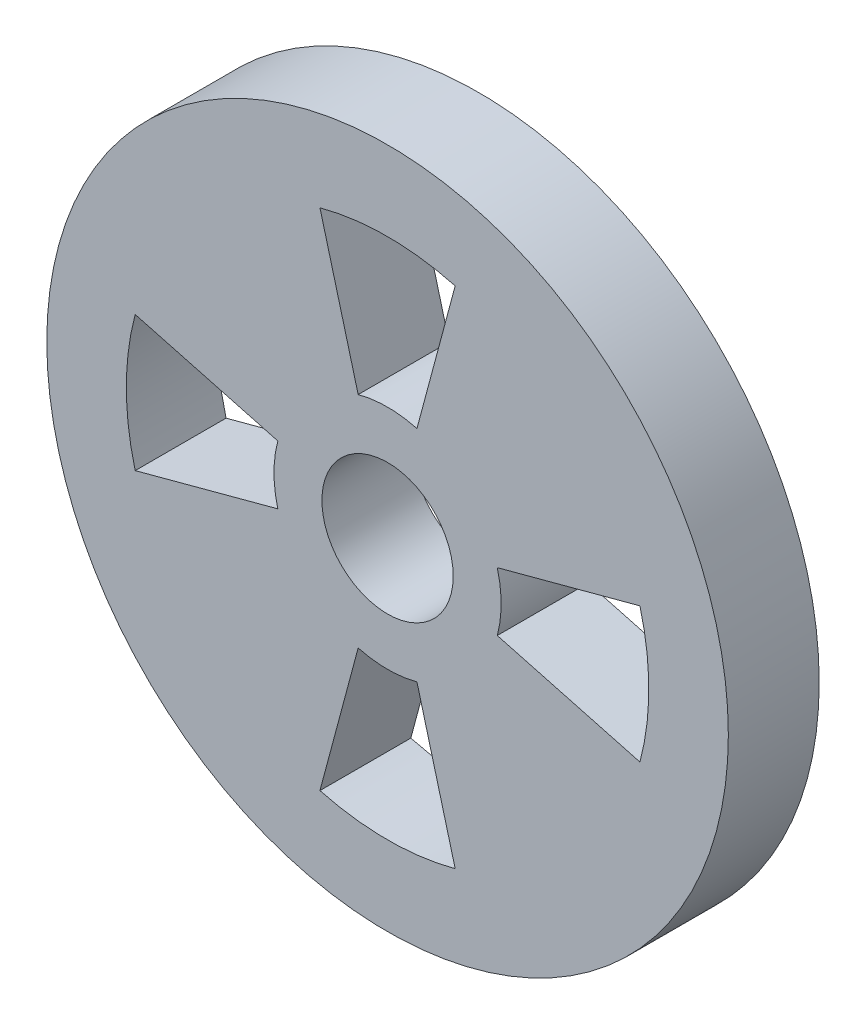
ISO-10303-21;
HEADER;
FILE_DESCRIPTION(('STEP AP214'),'2;1');
FILE_NAME('part.step','',(''),(''),'','','');
FILE_SCHEMA(('AUTOMOTIVE_DESIGN { 1 0 10303 214 1 1 1 1 }'));
ENDSEC;
DATA;
#1=APPLICATION_CONTEXT('core data for automotive mechanical design processes');
#2=APPLICATION_PROTOCOL_DEFINITION('international standard','automotive_design',2000,#1);
#3=PRODUCT_CONTEXT('',#1,'mechanical');
#4=PRODUCT('Part','Part','',(#3));
#5=PRODUCT_RELATED_PRODUCT_CATEGORY('part','',(#4));
#6=PRODUCT_DEFINITION_FORMATION('','',#4);
#7=PRODUCT_DEFINITION_CONTEXT('part definition',#1,'design');
#8=PRODUCT_DEFINITION('design','',#6,#7);
#9=PRODUCT_DEFINITION_SHAPE('','',#8);
#10=(LENGTH_UNIT() NAMED_UNIT(*) SI_UNIT(.MILLI.,.METRE.));
#11=(NAMED_UNIT(*) PLANE_ANGLE_UNIT() SI_UNIT($,.RADIAN.));
#12=(NAMED_UNIT(*) SI_UNIT($,.STERADIAN.) SOLID_ANGLE_UNIT());
#13=UNCERTAINTY_MEASURE_WITH_UNIT(LENGTH_MEASURE(1.E-05),#10,'distance_accuracy_value','');
#14=(GEOMETRIC_REPRESENTATION_CONTEXT(3) GLOBAL_UNCERTAINTY_ASSIGNED_CONTEXT((#13)) GLOBAL_UNIT_ASSIGNED_CONTEXT((#10,
#11,#12)) REPRESENTATION_CONTEXT('',''));
#15=CARTESIAN_POINT('',(0.,0.,0.));
#16=DIRECTION('',(0.,0.,1.));
#17=DIRECTION('',(1.,0.,0.));
#18=AXIS2_PLACEMENT_3D('',#15,#16,#17);
#19=CARTESIAN_POINT('',(0.,0.,4.));
#20=DIRECTION('',(0.,0.,1.));
#21=DIRECTION('',(1.,0.,0.));
#22=AXIS2_PLACEMENT_3D('',#19,#20,#21);
#23=PLANE('',#22);
#24=CARTESIAN_POINT('',(0.,0.,4.));
#25=DIRECTION('',(0.,0.,-1.));
#26=DIRECTION('',(1.,0.,0.));
#27=AXIS2_PLACEMENT_3D('',#24,#25,#26);
#28=CIRCLE('',#27,5.);
#29=CARTESIAN_POINT('',(-4.82962913144534,-1.29409522551261,4.));
#30=VERTEX_POINT('',#29);
#31=CARTESIAN_POINT('',(-4.82962913144534,1.29409522551261,4.));
#32=VERTEX_POINT('',#31);
#33=EDGE_CURVE('E55',#30,#32,#28,.T.);
#34=ORIENTED_EDGE('',*,*,#33,.F.);
#35=DIRECTION('',(0.965925826289068,0.258819045102522,0.));
#36=VECTOR('',#35,1.);
#37=CARTESIAN_POINT('',(-4.82962913144534,-1.29409522551261,4.));
#38=LINE('',#37,#36);
#39=CARTESIAN_POINT('',(-11.1081470023243,-2.976419018679,4.));
#40=VERTEX_POINT('',#39);
#41=EDGE_CURVE('E177',#40,#30,#38,.T.);
#42=ORIENTED_EDGE('',*,*,#41,.F.);
#43=CARTESIAN_POINT('',(0.,0.,4.));
#44=DIRECTION('',(0.,0.,1.));
#45=DIRECTION('',(1.,0.,0.));
#46=AXIS2_PLACEMENT_3D('',#43,#44,#45);
#47=CIRCLE('',#46,11.5);
#48=CARTESIAN_POINT('',(-11.1081470023243,2.976419018679,4.));
#49=VERTEX_POINT('',#48);
#50=EDGE_CURVE('E181',#49,#40,#47,.T.);
#51=ORIENTED_EDGE('',*,*,#50,.F.);
#52=DIRECTION('',(-0.965925826289068,0.258819045102521,0.));
#53=VECTOR('',#52,1.);
#54=CARTESIAN_POINT('',(-4.82962913144534,1.29409522551261,4.));
#55=LINE('',#54,#53);
#56=EDGE_CURVE('E190',#32,#49,#55,.T.);
#57=ORIENTED_EDGE('',*,*,#56,.F.);
#58=EDGE_LOOP('',(#34,#42,#51,#57));
#59=FACE_BOUND('',#58,.T.);
#60=CARTESIAN_POINT('',(0.,0.,4.));
#61=DIRECTION('',(0.,0.,-1.));
#62=DIRECTION('',(1.,0.,0.));
#63=AXIS2_PLACEMENT_3D('',#60,#61,#62);
#64=CIRCLE('',#63,5.);
#65=CARTESIAN_POINT('',(-1.29409522551261,4.82962913144534,4.));
#66=VERTEX_POINT('',#65);
#67=CARTESIAN_POINT('',(1.29409522551257,4.82962913144535,4.));
#68=VERTEX_POINT('',#67);
#69=EDGE_CURVE('E63',#66,#68,#64,.T.);
#70=ORIENTED_EDGE('',*,*,#69,.F.);
#71=DIRECTION('',(0.258819045102522,-0.965925826289068,0.));
#72=VECTOR('',#71,1.);
#73=CARTESIAN_POINT('',(-2.976419018679,11.1081470023243,4.));
#74=LINE('',#73,#72);
#75=CARTESIAN_POINT('',(-2.976419018679,11.1081470023243,4.));
#76=VERTEX_POINT('',#75);
#77=EDGE_CURVE('E211',#76,#66,#74,.T.);
#78=ORIENTED_EDGE('',*,*,#77,.F.);
#79=CARTESIAN_POINT('',(0.,0.,4.));
#80=DIRECTION('',(0.,0.,1.));
#81=DIRECTION('',(1.,0.,0.));
#82=AXIS2_PLACEMENT_3D('',#79,#80,#81);
#83=CIRCLE('',#82,11.5);
#84=CARTESIAN_POINT('',(2.97641901867891,11.1081470023243,4.));
#85=VERTEX_POINT('',#84);
#86=EDGE_CURVE('E231',#85,#76,#83,.T.);
#87=ORIENTED_EDGE('',*,*,#86,.F.);
#88=DIRECTION('',(0.258819045102514,0.96592582628907,0.));
#89=VECTOR('',#88,1.);
#90=CARTESIAN_POINT('',(1.29409522551257,4.82962913144535,4.));
#91=LINE('',#90,#89);
#92=EDGE_CURVE('E226',#68,#85,#91,.T.);
#93=ORIENTED_EDGE('',*,*,#92,.F.);
#94=EDGE_LOOP('',(#70,#78,#87,#93));
#95=FACE_BOUND('',#94,.T.);
#96=CARTESIAN_POINT('',(0.,0.,4.));
#97=DIRECTION('',(0.,0.,1.));
#98=DIRECTION('',(1.,0.,0.));
#99=AXIS2_PLACEMENT_3D('',#96,#97,#98);
#100=CIRCLE('',#99,11.5);
#101=CARTESIAN_POINT('',(11.1081470023243,-2.97641901867899,4.));
#102=VERTEX_POINT('',#101);
#103=CARTESIAN_POINT('',(11.1081470023243,2.976419018679,4.));
#104=VERTEX_POINT('',#103);
#105=EDGE_CURVE('E266',#102,#104,#100,.T.);
#106=ORIENTED_EDGE('',*,*,#105,.F.);
#107=DIRECTION('',(0.965925826289068,-0.258819045102521,0.));
#108=VECTOR('',#107,1.);
#109=CARTESIAN_POINT('',(11.1081470023243,-2.97641901867899,4.));
#110=LINE('',#109,#108);
#111=CARTESIAN_POINT('',(4.82962913144534,-1.29409522551261,4.));
#112=VERTEX_POINT('',#111);
#113=EDGE_CURVE('E253',#112,#102,#110,.T.);
#114=ORIENTED_EDGE('',*,*,#113,.F.);
#115=CARTESIAN_POINT('',(0.,0.,4.));
#116=DIRECTION('',(0.,0.,-1.));
#117=DIRECTION('',(1.,0.,0.));
#118=AXIS2_PLACEMENT_3D('',#115,#116,#117);
#119=CIRCLE('',#118,5.);
#120=CARTESIAN_POINT('',(4.82962913144534,1.29409522551261,4.));
#121=VERTEX_POINT('',#120);
#122=EDGE_CURVE('E274',#121,#112,#119,.T.);
#123=ORIENTED_EDGE('',*,*,#122,.F.);
#124=DIRECTION('',(-0.965925826289068,-0.258819045102522,0.));
#125=VECTOR('',#124,1.);
#126=CARTESIAN_POINT('',(11.1081470023243,2.976419018679,4.));
#127=LINE('',#126,#125);
#128=EDGE_CURVE('E269',#104,#121,#127,.T.);
#129=ORIENTED_EDGE('',*,*,#128,.F.);
#130=EDGE_LOOP('',(#106,#114,#123,#129));
#131=FACE_BOUND('',#130,.T.);
#132=CARTESIAN_POINT('',(0.,0.,4.));
#133=DIRECTION('',(0.,0.,1.));
#134=DIRECTION('',(1.,0.,0.));
#135=AXIS2_PLACEMENT_3D('',#132,#133,#134);
#136=CIRCLE('',#135,11.5);
#137=CARTESIAN_POINT('',(-2.97641901867891,-11.1081470023243,4.));
#138=VERTEX_POINT('',#137);
#139=CARTESIAN_POINT('',(2.976419018679,-11.1081470023243,4.));
#140=VERTEX_POINT('',#139);
#141=EDGE_CURVE('E310',#138,#140,#136,.T.);
#142=ORIENTED_EDGE('',*,*,#141,.F.);
#143=DIRECTION('',(-0.258819045102514,-0.96592582628907,0.));
#144=VECTOR('',#143,1.);
#145=CARTESIAN_POINT('',(-2.97641901867891,-11.1081470023243,4.));
#146=LINE('',#145,#144);
#147=CARTESIAN_POINT('',(-1.29409522551257,-4.82962913144535,4.));
#148=VERTEX_POINT('',#147);
#149=EDGE_CURVE('E297',#148,#138,#146,.T.);
#150=ORIENTED_EDGE('',*,*,#149,.F.);
#151=CARTESIAN_POINT('',(0.,0.,4.));
#152=DIRECTION('',(0.,0.,-1.));
#153=DIRECTION('',(1.,0.,0.));
#154=AXIS2_PLACEMENT_3D('',#151,#152,#153);
#155=CIRCLE('',#154,5.);
#156=CARTESIAN_POINT('',(1.29409522551261,-4.82962913144534,4.));
#157=VERTEX_POINT('',#156);
#158=EDGE_CURVE('E317',#157,#148,#155,.T.);
#159=ORIENTED_EDGE('',*,*,#158,.F.);
#160=DIRECTION('',(-0.258819045102522,0.965925826289068,0.));
#161=VECTOR('',#160,1.);
#162=CARTESIAN_POINT('',(1.29409522551261,-4.82962913144534,4.));
#163=LINE('',#162,#161);
#164=EDGE_CURVE('E313',#140,#157,#163,.T.);
#165=ORIENTED_EDGE('',*,*,#164,.F.);
#166=EDGE_LOOP('',(#142,#150,#159,#165));
#167=FACE_BOUND('',#166,.T.);
#168=CARTESIAN_POINT('',(0.,0.,4.));
#169=DIRECTION('',(0.,0.,1.));
#170=DIRECTION('',(1.,0.,0.));
#171=AXIS2_PLACEMENT_3D('',#168,#169,#170);
#172=CIRCLE('',#171,15.);
#173=CARTESIAN_POINT('',(15.,0.,4.));
#174=VERTEX_POINT('',#173);
#175=EDGE_CURVE('E11',#174,#174,#172,.T.);
#176=ORIENTED_EDGE('',*,*,#175,.T.);
#177=EDGE_LOOP('',(#176));
#178=FACE_BOUND('',#177,.T.);
#179=CARTESIAN_POINT('',(0.,0.,4.));
#180=DIRECTION('',(0.,0.,1.));
#181=DIRECTION('',(1.,0.,0.));
#182=AXIS2_PLACEMENT_3D('',#179,#180,#181);
#183=CIRCLE('',#182,2.89);
#184=CARTESIAN_POINT('',(2.89,0.,4.));
#185=VERTEX_POINT('',#184);
#186=EDGE_CURVE('E335',#185,#185,#183,.T.);
#187=ORIENTED_EDGE('',*,*,#186,.F.);
#188=EDGE_LOOP('',(#187));
#189=FACE_BOUND('',#188,.T.);
#190=ADVANCED_FACE('F39',(#59,#95,#131,#167,#178,#189),#23,.T.);
#191=CARTESIAN_POINT('',(0.,0.,0.));
#192=DIRECTION('',(0.,0.,1.));
#193=DIRECTION('',(1.,0.,0.));
#194=AXIS2_PLACEMENT_3D('',#191,#192,#193);
#195=PLANE('',#194);
#196=DIRECTION('',(0.965925826289068,0.258819045102522,0.));
#197=VECTOR('',#196,1.);
#198=CARTESIAN_POINT('',(-4.82962913144534,-1.29409522551261,0.));
#199=LINE('',#198,#197);
#200=CARTESIAN_POINT('',(-11.1081470023243,-2.976419018679,0.));
#201=VERTEX_POINT('',#200);
#202=CARTESIAN_POINT('',(-4.82962913144534,-1.29409522551261,0.));
#203=VERTEX_POINT('',#202);
#204=EDGE_CURVE('E162',#201,#203,#199,.T.);
#205=ORIENTED_EDGE('',*,*,#204,.T.);
#206=CARTESIAN_POINT('',(0.,0.,0.));
#207=DIRECTION('',(0.,0.,-1.));
#208=DIRECTION('',(1.,0.,0.));
#209=AXIS2_PLACEMENT_3D('',#206,#207,#208);
#210=CIRCLE('',#209,5.);
#211=CARTESIAN_POINT('',(-4.82962913144534,1.29409522551261,0.));
#212=VERTEX_POINT('',#211);
#213=EDGE_CURVE('E155',#203,#212,#210,.T.);
#214=ORIENTED_EDGE('',*,*,#213,.T.);
#215=DIRECTION('',(-0.965925826289068,0.258819045102521,0.));
#216=VECTOR('',#215,1.);
#217=CARTESIAN_POINT('',(-4.82962913144534,1.29409522551261,0.));
#218=LINE('',#217,#216);
#219=CARTESIAN_POINT('',(-11.1081470023243,2.97641901867899,0.));
#220=VERTEX_POINT('',#219);
#221=EDGE_CURVE('E166',#212,#220,#218,.T.);
#222=ORIENTED_EDGE('',*,*,#221,.T.);
#223=CARTESIAN_POINT('',(0.,0.,0.));
#224=DIRECTION('',(0.,0.,1.));
#225=DIRECTION('',(1.,0.,0.));
#226=AXIS2_PLACEMENT_3D('',#223,#224,#225);
#227=CIRCLE('',#226,11.5);
#228=EDGE_CURVE('E171',#220,#201,#227,.T.);
#229=ORIENTED_EDGE('',*,*,#228,.T.);
#230=EDGE_LOOP('',(#205,#214,#222,#229));
#231=FACE_BOUND('',#230,.T.);
#232=DIRECTION('',(0.258819045102522,-0.965925826289068,0.));
#233=VECTOR('',#232,1.);
#234=CARTESIAN_POINT('',(-2.976419018679,11.1081470023243,0.));
#235=LINE('',#234,#233);
#236=CARTESIAN_POINT('',(-2.976419018679,11.1081470023243,0.));
#237=VERTEX_POINT('',#236);
#238=CARTESIAN_POINT('',(-1.29409522551261,4.82962913144534,0.));
#239=VERTEX_POINT('',#238);
#240=EDGE_CURVE('E219',#237,#239,#235,.T.);
#241=ORIENTED_EDGE('',*,*,#240,.T.);
#242=CARTESIAN_POINT('',(0.,0.,0.));
#243=DIRECTION('',(0.,0.,-1.));
#244=DIRECTION('',(1.,0.,0.));
#245=AXIS2_PLACEMENT_3D('',#242,#243,#244);
#246=CIRCLE('',#245,5.);
#247=CARTESIAN_POINT('',(1.29409522551257,4.82962913144535,0.));
#248=VERTEX_POINT('',#247);
#249=EDGE_CURVE('E206',#239,#248,#246,.T.);
#250=ORIENTED_EDGE('',*,*,#249,.T.);
#251=DIRECTION('',(0.258819045102514,0.96592582628907,0.));
#252=VECTOR('',#251,1.);
#253=CARTESIAN_POINT('',(1.29409522551257,4.82962913144535,0.));
#254=LINE('',#253,#252);
#255=CARTESIAN_POINT('',(2.97641901867891,11.1081470023243,0.));
#256=VERTEX_POINT('',#255);
#257=EDGE_CURVE('E210',#248,#256,#254,.T.);
#258=ORIENTED_EDGE('',*,*,#257,.T.);
#259=CARTESIAN_POINT('',(0.,0.,0.));
#260=DIRECTION('',(0.,0.,1.));
#261=DIRECTION('',(1.,0.,0.));
#262=AXIS2_PLACEMENT_3D('',#259,#260,#261);
#263=CIRCLE('',#262,11.5);
#264=EDGE_CURVE('E215',#256,#237,#263,.T.);
#265=ORIENTED_EDGE('',*,*,#264,.T.);
#266=EDGE_LOOP('',(#241,#250,#258,#265));
#267=FACE_BOUND('',#266,.T.);
#268=DIRECTION('',(0.965925826289068,-0.258819045102521,0.));
#269=VECTOR('',#268,1.);
#270=CARTESIAN_POINT('',(11.1081470023243,-2.97641901867899,0.));
#271=LINE('',#270,#269);
#272=CARTESIAN_POINT('',(4.82962913144534,-1.29409522551261,0.));
#273=VERTEX_POINT('',#272);
#274=CARTESIAN_POINT('',(11.1081470023243,-2.97641901867899,0.));
#275=VERTEX_POINT('',#274);
#276=EDGE_CURVE('E261',#273,#275,#271,.T.);
#277=ORIENTED_EDGE('',*,*,#276,.T.);
#278=CARTESIAN_POINT('',(0.,0.,0.));
#279=DIRECTION('',(0.,0.,1.));
#280=DIRECTION('',(1.,0.,0.));
#281=AXIS2_PLACEMENT_3D('',#278,#279,#280);
#282=CIRCLE('',#281,11.5);
#283=CARTESIAN_POINT('',(11.1081470023243,2.976419018679,0.));
#284=VERTEX_POINT('',#283);
#285=EDGE_CURVE('E248',#275,#284,#282,.T.);
#286=ORIENTED_EDGE('',*,*,#285,.T.);
#287=DIRECTION('',(-0.965925826289068,-0.258819045102522,0.));
#288=VECTOR('',#287,1.);
#289=CARTESIAN_POINT('',(11.1081470023243,2.976419018679,0.));
#290=LINE('',#289,#288);
#291=CARTESIAN_POINT('',(4.82962913144534,1.29409522551261,0.));
#292=VERTEX_POINT('',#291);
#293=EDGE_CURVE('E252',#284,#292,#290,.T.);
#294=ORIENTED_EDGE('',*,*,#293,.T.);
#295=CARTESIAN_POINT('',(0.,0.,0.));
#296=DIRECTION('',(0.,0.,-1.));
#297=DIRECTION('',(1.,0.,0.));
#298=AXIS2_PLACEMENT_3D('',#295,#296,#297);
#299=CIRCLE('',#298,5.);
#300=EDGE_CURVE('E257',#292,#273,#299,.T.);
#301=ORIENTED_EDGE('',*,*,#300,.T.);
#302=EDGE_LOOP('',(#277,#286,#294,#301));
#303=FACE_BOUND('',#302,.T.);
#304=DIRECTION('',(-0.258819045102514,-0.96592582628907,0.));
#305=VECTOR('',#304,1.);
#306=CARTESIAN_POINT('',(-2.97641901867891,-11.1081470023243,0.));
#307=LINE('',#306,#305);
#308=CARTESIAN_POINT('',(-1.29409522551257,-4.82962913144535,0.));
#309=VERTEX_POINT('',#308);
#310=CARTESIAN_POINT('',(-2.97641901867891,-11.1081470023243,0.));
#311=VERTEX_POINT('',#310);
#312=EDGE_CURVE('E305',#309,#311,#307,.T.);
#313=ORIENTED_EDGE('',*,*,#312,.T.);
#314=CARTESIAN_POINT('',(0.,0.,0.));
#315=DIRECTION('',(0.,0.,1.));
#316=DIRECTION('',(1.,0.,0.));
#317=AXIS2_PLACEMENT_3D('',#314,#315,#316);
#318=CIRCLE('',#317,11.5);
#319=CARTESIAN_POINT('',(2.976419018679,-11.1081470023243,0.));
#320=VERTEX_POINT('',#319);
#321=EDGE_CURVE('E292',#311,#320,#318,.T.);
#322=ORIENTED_EDGE('',*,*,#321,.T.);
#323=DIRECTION('',(-0.258819045102522,0.965925826289068,0.));
#324=VECTOR('',#323,1.);
#325=CARTESIAN_POINT('',(1.29409522551261,-4.82962913144534,0.));
#326=LINE('',#325,#324);
#327=CARTESIAN_POINT('',(1.29409522551261,-4.82962913144534,0.));
#328=VERTEX_POINT('',#327);
#329=EDGE_CURVE('E296',#320,#328,#326,.T.);
#330=ORIENTED_EDGE('',*,*,#329,.T.);
#331=CARTESIAN_POINT('',(0.,0.,0.));
#332=DIRECTION('',(0.,0.,-1.));
#333=DIRECTION('',(1.,0.,0.));
#334=AXIS2_PLACEMENT_3D('',#331,#332,#333);
#335=CIRCLE('',#334,5.);
#336=EDGE_CURVE('E301',#328,#309,#335,.T.);
#337=ORIENTED_EDGE('',*,*,#336,.T.);
#338=EDGE_LOOP('',(#313,#322,#330,#337));
#339=FACE_BOUND('',#338,.T.);
#340=CARTESIAN_POINT('',(0.,0.,0.));
#341=DIRECTION('',(0.,0.,1.));
#342=DIRECTION('',(1.,0.,0.));
#343=AXIS2_PLACEMENT_3D('',#340,#341,#342);
#344=CIRCLE('',#343,15.);
#345=CARTESIAN_POINT('',(15.,0.,0.));
#346=VERTEX_POINT('',#345);
#347=EDGE_CURVE('E43',#346,#346,#344,.T.);
#348=ORIENTED_EDGE('',*,*,#347,.F.);
#349=EDGE_LOOP('',(#348));
#350=FACE_BOUND('',#349,.T.);
#351=CARTESIAN_POINT('',(0.,0.,0.));
#352=DIRECTION('',(0.,0.,1.));
#353=DIRECTION('',(1.,0.,0.));
#354=AXIS2_PLACEMENT_3D('',#351,#352,#353);
#355=CIRCLE('',#354,2.89);
#356=CARTESIAN_POINT('',(2.89,0.,0.));
#357=VERTEX_POINT('',#356);
#358=EDGE_CURVE('E200',#357,#357,#355,.T.);
#359=ORIENTED_EDGE('',*,*,#358,.T.);
#360=EDGE_LOOP('',(#359));
#361=FACE_BOUND('',#360,.T.);
#362=ADVANCED_FACE('F173',(#231,#267,#303,#339,#350,#361),#195,.F.);
#363=CARTESIAN_POINT('',(0.,0.,4.));
#364=DIRECTION('',(0.,0.,-1.));
#365=DIRECTION('',(-1.,0.,0.));
#366=AXIS2_PLACEMENT_3D('',#363,#364,#365);
#367=CYLINDRICAL_SURFACE('',#366,15.);
#368=ORIENTED_EDGE('',*,*,#175,.F.);
#369=EDGE_LOOP('',(#368));
#370=FACE_BOUND('',#369,.T.);
#371=ORIENTED_EDGE('',*,*,#347,.T.);
#372=EDGE_LOOP('',(#371));
#373=FACE_BOUND('',#372,.T.);
#374=ADVANCED_FACE('F41',(#370,#373),#367,.T.);
#375=CARTESIAN_POINT('',(0.,0.,4.));
#376=DIRECTION('',(0.,0.,-1.));
#377=DIRECTION('',(-1.,0.,0.));
#378=AXIS2_PLACEMENT_3D('',#375,#376,#377);
#379=CYLINDRICAL_SURFACE('',#378,2.89);
#380=ORIENTED_EDGE('',*,*,#186,.T.);
#381=EDGE_LOOP('',(#380));
#382=FACE_BOUND('',#381,.T.);
#383=ORIENTED_EDGE('',*,*,#358,.F.);
#384=EDGE_LOOP('',(#383));
#385=FACE_BOUND('',#384,.T.);
#386=ADVANCED_FACE('F344',(#382,#385),#379,.F.);
#387=CARTESIAN_POINT('',(0.,0.,0.));
#388=DIRECTION('',(0.,0.,1.));
#389=DIRECTION('',(1.,0.,0.));
#390=AXIS2_PLACEMENT_3D('',#387,#388,#389);
#391=CYLINDRICAL_SURFACE('',#390,11.5);
#392=ORIENTED_EDGE('',*,*,#141,.T.);
#393=DIRECTION('',(0.,0.,1.));
#394=VECTOR('',#393,1.);
#395=CARTESIAN_POINT('',(2.976419018679,-11.1081470023243,0.));
#396=LINE('',#395,#394);
#397=EDGE_CURVE('E309',#320,#140,#396,.T.);
#398=ORIENTED_EDGE('',*,*,#397,.F.);
#399=ORIENTED_EDGE('',*,*,#321,.F.);
#400=DIRECTION('',(0.,0.,1.));
#401=VECTOR('',#400,1.);
#402=CARTESIAN_POINT('',(-2.97641901867891,-11.1081470023243,0.));
#403=LINE('',#402,#401);
#404=EDGE_CURVE('E270',#311,#138,#403,.T.);
#405=ORIENTED_EDGE('',*,*,#404,.T.);
#406=EDGE_LOOP('',(#392,#398,#399,#405));
#407=FACE_BOUND('',#406,.T.);
#408=ADVANCED_FACE('F346',(#407),#391,.F.);
#409=CARTESIAN_POINT('',(-2.97641901867891,-11.1081470023243,0.));
#410=DIRECTION('',(-0.96592582628907,0.258819045102514,0.));
#411=DIRECTION('',(-0.258819045102514,-0.96592582628907,0.));
#412=AXIS2_PLACEMENT_3D('',#409,#410,#411);
#413=PLANE('',#412);
#414=ORIENTED_EDGE('',*,*,#149,.T.);
#415=ORIENTED_EDGE('',*,*,#404,.F.);
#416=ORIENTED_EDGE('',*,*,#312,.F.);
#417=DIRECTION('',(0.,0.,1.));
#418=VECTOR('',#417,1.);
#419=CARTESIAN_POINT('',(-1.29409522551257,-4.82962913144535,0.));
#420=LINE('',#419,#418);
#421=EDGE_CURVE('E326',#309,#148,#420,.T.);
#422=ORIENTED_EDGE('',*,*,#421,.T.);
#423=EDGE_LOOP('',(#414,#415,#416,#422));
#424=FACE_BOUND('',#423,.T.);
#425=ADVANCED_FACE('F353',(#424),#413,.F.);
#426=CARTESIAN_POINT('',(0.,0.,0.));
#427=DIRECTION('',(0.,0.,1.));
#428=DIRECTION('',(1.,0.,0.));
#429=AXIS2_PLACEMENT_3D('',#426,#427,#428);
#430=CYLINDRICAL_SURFACE('',#429,5.);
#431=ORIENTED_EDGE('',*,*,#158,.T.);
#432=ORIENTED_EDGE('',*,*,#421,.F.);
#433=ORIENTED_EDGE('',*,*,#336,.F.);
#434=DIRECTION('',(0.,0.,1.));
#435=VECTOR('',#434,1.);
#436=CARTESIAN_POINT('',(1.29409522551261,-4.82962913144534,0.));
#437=LINE('',#436,#435);
#438=EDGE_CURVE('E329',#328,#157,#437,.T.);
#439=ORIENTED_EDGE('',*,*,#438,.T.);
#440=EDGE_LOOP('',(#431,#432,#433,#439));
#441=FACE_BOUND('',#440,.T.);
#442=ADVANCED_FACE('F394',(#441),#430,.T.);
#443=CARTESIAN_POINT('',(1.29409522551261,-4.82962913144534,0.));
#444=DIRECTION('',(0.965925826289068,0.258819045102522,0.));
#445=DIRECTION('',(-0.258819045102522,0.965925826289068,0.));
#446=AXIS2_PLACEMENT_3D('',#443,#444,#445);
#447=PLANE('',#446);
#448=ORIENTED_EDGE('',*,*,#164,.T.);
#449=ORIENTED_EDGE('',*,*,#438,.F.);
#450=ORIENTED_EDGE('',*,*,#329,.F.);
#451=ORIENTED_EDGE('',*,*,#397,.T.);
#452=EDGE_LOOP('',(#448,#449,#450,#451));
#453=FACE_BOUND('',#452,.T.);
#454=ADVANCED_FACE('F388',(#453),#447,.F.);
#455=CARTESIAN_POINT('',(0.,0.,0.));
#456=DIRECTION('',(0.,0.,1.));
#457=DIRECTION('',(1.,0.,0.));
#458=AXIS2_PLACEMENT_3D('',#455,#456,#457);
#459=CYLINDRICAL_SURFACE('',#458,11.5);
#460=ORIENTED_EDGE('',*,*,#105,.T.);
#461=DIRECTION('',(0.,0.,1.));
#462=VECTOR('',#461,1.);
#463=CARTESIAN_POINT('',(11.1081470023243,2.976419018679,0.));
#464=LINE('',#463,#462);
#465=EDGE_CURVE('E265',#284,#104,#464,.T.);
#466=ORIENTED_EDGE('',*,*,#465,.F.);
#467=ORIENTED_EDGE('',*,*,#285,.F.);
#468=DIRECTION('',(0.,0.,1.));
#469=VECTOR('',#468,1.);
#470=CARTESIAN_POINT('',(11.1081470023243,-2.97641901867899,0.));
#471=LINE('',#470,#469);
#472=EDGE_CURVE('E227',#275,#102,#471,.T.);
#473=ORIENTED_EDGE('',*,*,#472,.T.);
#474=EDGE_LOOP('',(#460,#466,#467,#473));
#475=FACE_BOUND('',#474,.T.);
#476=ADVANCED_FACE('F401',(#475),#459,.F.);
#477=CARTESIAN_POINT('',(11.1081470023243,-2.97641901867899,0.));
#478=DIRECTION('',(-0.258819045102521,-0.965925826289068,0.));
#479=DIRECTION('',(0.965925826289068,-0.258819045102521,0.));
#480=AXIS2_PLACEMENT_3D('',#477,#478,#479);
#481=PLANE('',#480);
#482=ORIENTED_EDGE('',*,*,#113,.T.);
#483=ORIENTED_EDGE('',*,*,#472,.F.);
#484=ORIENTED_EDGE('',*,*,#276,.F.);
#485=DIRECTION('',(0.,0.,1.));
#486=VECTOR('',#485,1.);
#487=CARTESIAN_POINT('',(4.82962913144534,-1.29409522551261,0.));
#488=LINE('',#487,#486);
#489=EDGE_CURVE('E283',#273,#112,#488,.T.);
#490=ORIENTED_EDGE('',*,*,#489,.T.);
#491=EDGE_LOOP('',(#482,#483,#484,#490));
#492=FACE_BOUND('',#491,.T.);
#493=ADVANCED_FACE('F407',(#492),#481,.F.);
#494=CARTESIAN_POINT('',(0.,0.,0.));
#495=DIRECTION('',(0.,0.,1.));
#496=DIRECTION('',(1.,0.,0.));
#497=AXIS2_PLACEMENT_3D('',#494,#495,#496);
#498=CYLINDRICAL_SURFACE('',#497,5.);
#499=ORIENTED_EDGE('',*,*,#122,.T.);
#500=ORIENTED_EDGE('',*,*,#489,.F.);
#501=ORIENTED_EDGE('',*,*,#300,.F.);
#502=DIRECTION('',(0.,0.,1.));
#503=VECTOR('',#502,1.);
#504=CARTESIAN_POINT('',(4.82962913144534,1.29409522551261,0.));
#505=LINE('',#504,#503);
#506=EDGE_CURVE('E286',#292,#121,#505,.T.);
#507=ORIENTED_EDGE('',*,*,#506,.T.);
#508=EDGE_LOOP('',(#499,#500,#501,#507));
#509=FACE_BOUND('',#508,.T.);
#510=ADVANCED_FACE('F413',(#509),#498,.T.);
#511=CARTESIAN_POINT('',(11.1081470023243,2.976419018679,0.));
#512=DIRECTION('',(-0.258819045102522,0.965925826289068,0.));
#513=DIRECTION('',(-0.965925826289068,-0.258819045102522,0.));
#514=AXIS2_PLACEMENT_3D('',#511,#512,#513);
#515=PLANE('',#514);
#516=ORIENTED_EDGE('',*,*,#128,.T.);
#517=ORIENTED_EDGE('',*,*,#506,.F.);
#518=ORIENTED_EDGE('',*,*,#293,.F.);
#519=ORIENTED_EDGE('',*,*,#465,.T.);
#520=EDGE_LOOP('',(#516,#517,#518,#519));
#521=FACE_BOUND('',#520,.T.);
#522=ADVANCED_FACE('F409',(#521),#515,.F.);
#523=CARTESIAN_POINT('',(0.,0.,0.));
#524=DIRECTION('',(0.,0.,1.));
#525=DIRECTION('',(1.,0.,0.));
#526=AXIS2_PLACEMENT_3D('',#523,#524,#525);
#527=CYLINDRICAL_SURFACE('',#526,5.);
#528=ORIENTED_EDGE('',*,*,#69,.T.);
#529=DIRECTION('',(0.,0.,1.));
#530=VECTOR('',#529,1.);
#531=CARTESIAN_POINT('',(1.29409522551257,4.82962913144535,0.));
#532=LINE('',#531,#530);
#533=EDGE_CURVE('E223',#248,#68,#532,.T.);
#534=ORIENTED_EDGE('',*,*,#533,.F.);
#535=ORIENTED_EDGE('',*,*,#249,.F.);
#536=DIRECTION('',(0.,0.,1.));
#537=VECTOR('',#536,1.);
#538=CARTESIAN_POINT('',(-1.29409522551261,4.82962913144534,0.));
#539=LINE('',#538,#537);
#540=EDGE_CURVE('E191',#239,#66,#539,.T.);
#541=ORIENTED_EDGE('',*,*,#540,.T.);
#542=EDGE_LOOP('',(#528,#534,#535,#541));
#543=FACE_BOUND('',#542,.T.);
#544=ADVANCED_FACE('F412',(#543),#527,.T.);
#545=CARTESIAN_POINT('',(-2.976419018679,11.1081470023243,0.));
#546=DIRECTION('',(-0.965925826289068,-0.258819045102522,0.));
#547=DIRECTION('',(0.258819045102522,-0.965925826289068,0.));
#548=AXIS2_PLACEMENT_3D('',#545,#546,#547);
#549=PLANE('',#548);
#550=ORIENTED_EDGE('',*,*,#77,.T.);
#551=ORIENTED_EDGE('',*,*,#540,.F.);
#552=ORIENTED_EDGE('',*,*,#240,.F.);
#553=DIRECTION('',(0.,0.,1.));
#554=VECTOR('',#553,1.);
#555=CARTESIAN_POINT('',(-2.976419018679,11.1081470023243,0.));
#556=LINE('',#555,#554);
#557=EDGE_CURVE('E240',#237,#76,#556,.T.);
#558=ORIENTED_EDGE('',*,*,#557,.T.);
#559=EDGE_LOOP('',(#550,#551,#552,#558));
#560=FACE_BOUND('',#559,.T.);
#561=ADVANCED_FACE('F423',(#560),#549,.F.);
#562=CARTESIAN_POINT('',(0.,0.,0.));
#563=DIRECTION('',(0.,0.,1.));
#564=DIRECTION('',(1.,0.,0.));
#565=AXIS2_PLACEMENT_3D('',#562,#563,#564);
#566=CYLINDRICAL_SURFACE('',#565,11.5);
#567=ORIENTED_EDGE('',*,*,#86,.T.);
#568=ORIENTED_EDGE('',*,*,#557,.F.);
#569=ORIENTED_EDGE('',*,*,#264,.F.);
#570=DIRECTION('',(0.,0.,1.));
#571=VECTOR('',#570,1.);
#572=CARTESIAN_POINT('',(2.97641901867891,11.1081470023243,0.));
#573=LINE('',#572,#571);
#574=EDGE_CURVE('E243',#256,#85,#573,.T.);
#575=ORIENTED_EDGE('',*,*,#574,.T.);
#576=EDGE_LOOP('',(#567,#568,#569,#575));
#577=FACE_BOUND('',#576,.T.);
#578=ADVANCED_FACE('F427',(#577),#566,.F.);
#579=CARTESIAN_POINT('',(1.29409522551257,4.82962913144535,0.));
#580=DIRECTION('',(0.96592582628907,-0.258819045102514,0.));
#581=DIRECTION('',(0.258819045102514,0.96592582628907,0.));
#582=AXIS2_PLACEMENT_3D('',#579,#580,#581);
#583=PLANE('',#582);
#584=ORIENTED_EDGE('',*,*,#92,.T.);
#585=ORIENTED_EDGE('',*,*,#574,.F.);
#586=ORIENTED_EDGE('',*,*,#257,.F.);
#587=ORIENTED_EDGE('',*,*,#533,.T.);
#588=EDGE_LOOP('',(#584,#585,#586,#587));
#589=FACE_BOUND('',#588,.T.);
#590=ADVANCED_FACE('F424',(#589),#583,.F.);
#591=CARTESIAN_POINT('',(0.,0.,0.));
#592=DIRECTION('',(0.,0.,1.));
#593=DIRECTION('',(1.,0.,0.));
#594=AXIS2_PLACEMENT_3D('',#591,#592,#593);
#595=CYLINDRICAL_SURFACE('',#594,5.);
#596=ORIENTED_EDGE('',*,*,#33,.T.);
#597=DIRECTION('',(0.,0.,1.));
#598=VECTOR('',#597,1.);
#599=CARTESIAN_POINT('',(-4.82962913144534,1.29409522551261,0.));
#600=LINE('',#599,#598);
#601=EDGE_CURVE('E151',#212,#32,#600,.T.);
#602=ORIENTED_EDGE('',*,*,#601,.F.);
#603=ORIENTED_EDGE('',*,*,#213,.F.);
#604=DIRECTION('',(0.,0.,1.));
#605=VECTOR('',#604,1.);
#606=CARTESIAN_POINT('',(-4.82962913144534,-1.29409522551261,0.));
#607=LINE('',#606,#605);
#608=EDGE_CURVE('E197',#203,#30,#607,.T.);
#609=ORIENTED_EDGE('',*,*,#608,.T.);
#610=EDGE_LOOP('',(#596,#602,#603,#609));
#611=FACE_BOUND('',#610,.T.);
#612=ADVANCED_FACE('F153',(#611),#595,.T.);
#613=CARTESIAN_POINT('',(-4.82962913144534,-1.29409522551261,0.));
#614=DIRECTION('',(0.258819045102522,-0.965925826289068,0.));
#615=DIRECTION('',(0.965925826289068,0.258819045102522,0.));
#616=AXIS2_PLACEMENT_3D('',#613,#614,#615);
#617=PLANE('',#616);
#618=ORIENTED_EDGE('',*,*,#41,.T.);
#619=ORIENTED_EDGE('',*,*,#608,.F.);
#620=ORIENTED_EDGE('',*,*,#204,.F.);
#621=DIRECTION('',(0.,0.,1.));
#622=VECTOR('',#621,1.);
#623=CARTESIAN_POINT('',(-11.1081470023243,-2.976419018679,0.));
#624=LINE('',#623,#622);
#625=EDGE_CURVE('E201',#201,#40,#624,.T.);
#626=ORIENTED_EDGE('',*,*,#625,.T.);
#627=EDGE_LOOP('',(#618,#619,#620,#626));
#628=FACE_BOUND('',#627,.T.);
#629=ADVANCED_FACE('F437',(#628),#617,.F.);
#630=CARTESIAN_POINT('',(0.,0.,0.));
#631=DIRECTION('',(0.,0.,1.));
#632=DIRECTION('',(1.,0.,0.));
#633=AXIS2_PLACEMENT_3D('',#630,#631,#632);
#634=CYLINDRICAL_SURFACE('',#633,11.5);
#635=ORIENTED_EDGE('',*,*,#50,.T.);
#636=ORIENTED_EDGE('',*,*,#625,.F.);
#637=ORIENTED_EDGE('',*,*,#228,.F.);
#638=DIRECTION('',(0.,0.,1.));
#639=VECTOR('',#638,1.);
#640=CARTESIAN_POINT('',(-11.1081470023243,2.976419018679,0.));
#641=LINE('',#640,#639);
#642=EDGE_CURVE('E161',#220,#49,#641,.T.);
#643=ORIENTED_EDGE('',*,*,#642,.T.);
#644=EDGE_LOOP('',(#635,#636,#637,#643));
#645=FACE_BOUND('',#644,.T.);
#646=ADVANCED_FACE('F440',(#645),#634,.F.);
#647=CARTESIAN_POINT('',(-4.82962913144534,1.29409522551261,0.));
#648=DIRECTION('',(0.258819045102521,0.965925826289068,0.));
#649=DIRECTION('',(-0.965925826289068,0.258819045102521,0.));
#650=AXIS2_PLACEMENT_3D('',#647,#648,#649);
#651=PLANE('',#650);
#652=ORIENTED_EDGE('',*,*,#56,.T.);
#653=ORIENTED_EDGE('',*,*,#642,.F.);
#654=ORIENTED_EDGE('',*,*,#221,.F.);
#655=ORIENTED_EDGE('',*,*,#601,.T.);
#656=EDGE_LOOP('',(#652,#653,#654,#655));
#657=FACE_BOUND('',#656,.T.);
#658=ADVANCED_FACE('F167',(#657),#651,.F.);
#659=CLOSED_SHELL('',(#190,#362,#374,#386,#408,#425,#442,#454,#476,#493,#510,#522,#544,#561,
#578,#590,#612,#629,#646,#658));
#660=MANIFOLD_SOLID_BREP('B2',#659);
#661=ADVANCED_BREP_SHAPE_REPRESENTATION('',(#18,#660),#14);
#662=SHAPE_DEFINITION_REPRESENTATION(#9,#661);
ENDSEC;
END-ISO-10303-21;
